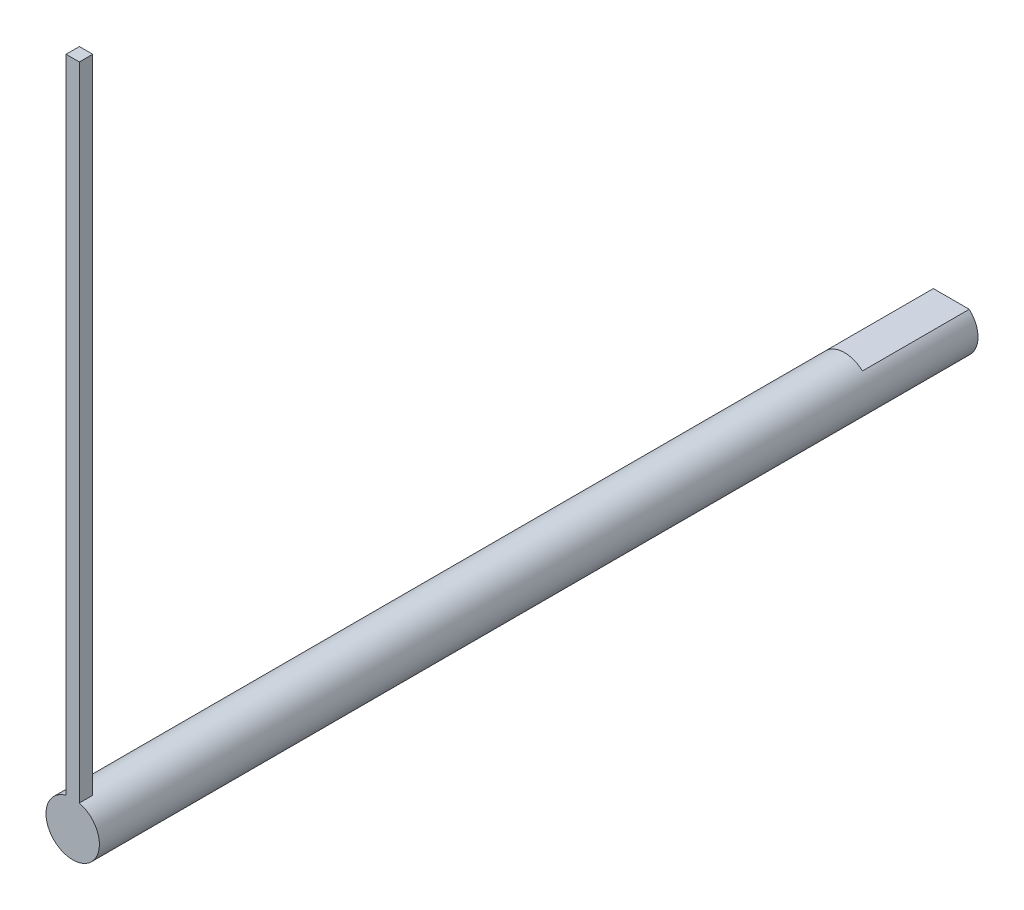
ISO-10303-21;
HEADER;
FILE_DESCRIPTION(('STEP AP214'),'2;1');
FILE_NAME('part.step','',(''),(''),'','','');
FILE_SCHEMA(('AUTOMOTIVE_DESIGN { 1 0 10303 214 1 1 1 1 }'));
ENDSEC;
DATA;
#1=APPLICATION_CONTEXT('core data for automotive mechanical design processes');
#2=APPLICATION_PROTOCOL_DEFINITION('international standard','automotive_design',2000,#1);
#3=PRODUCT_CONTEXT('',#1,'mechanical');
#4=PRODUCT('Part','Part','',(#3));
#5=PRODUCT_RELATED_PRODUCT_CATEGORY('part','',(#4));
#6=PRODUCT_DEFINITION_FORMATION('','',#4);
#7=PRODUCT_DEFINITION_CONTEXT('part definition',#1,'design');
#8=PRODUCT_DEFINITION('design','',#6,#7);
#9=PRODUCT_DEFINITION_SHAPE('','',#8);
#10=(LENGTH_UNIT() NAMED_UNIT(*) SI_UNIT(.MILLI.,.METRE.));
#11=(NAMED_UNIT(*) PLANE_ANGLE_UNIT() SI_UNIT($,.RADIAN.));
#12=(NAMED_UNIT(*) SI_UNIT($,.STERADIAN.) SOLID_ANGLE_UNIT());
#13=UNCERTAINTY_MEASURE_WITH_UNIT(LENGTH_MEASURE(1.E-05),#10,'distance_accuracy_value','');
#14=(GEOMETRIC_REPRESENTATION_CONTEXT(3) GLOBAL_UNCERTAINTY_ASSIGNED_CONTEXT((#13)) GLOBAL_UNIT_ASSIGNED_CONTEXT((#10,
#11,#12)) REPRESENTATION_CONTEXT('',''));
#15=CARTESIAN_POINT('',(0.,0.,0.));
#16=DIRECTION('',(0.,0.,1.));
#17=DIRECTION('',(1.,0.,0.));
#18=AXIS2_PLACEMENT_3D('',#15,#16,#17);
#19=CARTESIAN_POINT('',(0.,0.,65.8));
#20=DIRECTION('',(0.,0.,-1.));
#21=DIRECTION('',(-1.,0.,0.));
#22=AXIS2_PLACEMENT_3D('',#19,#20,#21);
#23=CYLINDRICAL_SURFACE('',#22,2.);
#24=CARTESIAN_POINT('',(0.,0.,64.8));
#25=DIRECTION('',(0.,0.,-1.));
#26=DIRECTION('',(-1.,0.,0.));
#27=AXIS2_PLACEMENT_3D('',#24,#25,#26);
#28=CIRCLE('',#27,2.);
#29=CARTESIAN_POINT('',(-0.5,1.93649167310371,64.8));
#30=VERTEX_POINT('',#29);
#31=CARTESIAN_POINT('',(0.5,1.93649167310371,64.8));
#32=VERTEX_POINT('',#31);
#33=EDGE_CURVE('E11',#30,#32,#28,.T.);
#34=ORIENTED_EDGE('',*,*,#33,.T.);
#35=DIRECTION('',(0.,0.,-1.));
#36=VECTOR('',#35,1.);
#37=CARTESIAN_POINT('',(0.5,1.93649167310371,65.8));
#38=LINE('',#37,#36);
#39=CARTESIAN_POINT('',(0.5,1.93649167310371,65.8));
#40=VERTEX_POINT('',#39);
#41=EDGE_CURVE('E106',#32,#40,#38,.F.);
#42=ORIENTED_EDGE('',*,*,#41,.T.);
#43=CARTESIAN_POINT('',(0.,0.,65.8));
#44=DIRECTION('',(0.,0.,1.));
#45=DIRECTION('',(1.,0.,0.));
#46=AXIS2_PLACEMENT_3D('',#43,#44,#45);
#47=CIRCLE('',#46,2.);
#48=CARTESIAN_POINT('',(-0.5,1.93649167310371,65.8));
#49=VERTEX_POINT('',#48);
#50=EDGE_CURVE('E52',#49,#40,#47,.T.);
#51=ORIENTED_EDGE('',*,*,#50,.F.);
#52=DIRECTION('',(0.,0.,-1.));
#53=VECTOR('',#52,1.);
#54=CARTESIAN_POINT('',(-0.5,1.93649167310371,65.8));
#55=LINE('',#54,#53);
#56=EDGE_CURVE('E128',#49,#30,#55,.T.);
#57=ORIENTED_EDGE('',*,*,#56,.T.);
#58=EDGE_LOOP('',(#34,#42,#51,#57));
#59=FACE_BOUND('',#58,.T.);
#60=CARTESIAN_POINT('',(0.,0.,8.));
#61=DIRECTION('',(0.,0.,-1.));
#62=DIRECTION('',(-1.,0.,0.));
#63=AXIS2_PLACEMENT_3D('',#60,#61,#62);
#64=CIRCLE('',#63,2.);
#65=CARTESIAN_POINT('',(-1.34521373766402,1.48,8.));
#66=VERTEX_POINT('',#65);
#67=CARTESIAN_POINT('',(1.34521373766402,1.48,8.));
#68=VERTEX_POINT('',#67);
#69=EDGE_CURVE('E134',#66,#68,#64,.T.);
#70=ORIENTED_EDGE('',*,*,#69,.F.);
#71=DIRECTION('',(0.,0.,-1.));
#72=VECTOR('',#71,1.);
#73=CARTESIAN_POINT('',(-1.34521373766402,1.48,8.));
#74=LINE('',#73,#72);
#75=CARTESIAN_POINT('',(-1.34521373766402,1.48,0.));
#76=VERTEX_POINT('',#75);
#77=EDGE_CURVE('E140',#66,#76,#74,.T.);
#78=ORIENTED_EDGE('',*,*,#77,.T.);
#79=CARTESIAN_POINT('',(0.,0.,0.));
#80=DIRECTION('',(0.,0.,1.));
#81=DIRECTION('',(1.,0.,0.));
#82=AXIS2_PLACEMENT_3D('',#79,#80,#81);
#83=CIRCLE('',#82,2.);
#84=CARTESIAN_POINT('',(1.34521373766402,1.48,0.));
#85=VERTEX_POINT('',#84);
#86=EDGE_CURVE('E143',#76,#85,#83,.T.);
#87=ORIENTED_EDGE('',*,*,#86,.T.);
#88=DIRECTION('',(0.,0.,-1.));
#89=VECTOR('',#88,1.);
#90=CARTESIAN_POINT('',(1.34521373766402,1.48,8.));
#91=LINE('',#90,#89);
#92=EDGE_CURVE('E67',#68,#85,#91,.T.);
#93=ORIENTED_EDGE('',*,*,#92,.F.);
#94=EDGE_LOOP('',(#70,#78,#87,#93));
#95=FACE_BOUND('',#94,.T.);
#96=ADVANCED_FACE('F45',(#59,#95),#23,.T.);
#97=CARTESIAN_POINT('',(0.,0.,65.8));
#98=DIRECTION('',(0.,0.,1.));
#99=DIRECTION('',(1.,0.,0.));
#100=AXIS2_PLACEMENT_3D('',#97,#98,#99);
#101=PLANE('',#100);
#102=ORIENTED_EDGE('',*,*,#50,.T.);
#103=DIRECTION('',(0.,1.,0.));
#104=VECTOR('',#103,1.);
#105=CARTESIAN_POINT('',(0.5,0.,65.8));
#106=LINE('',#105,#104);
#107=CARTESIAN_POINT('',(0.499999999999991,50.,65.8));
#108=VERTEX_POINT('',#107);
#109=EDGE_CURVE('E124',#40,#108,#106,.T.);
#110=ORIENTED_EDGE('',*,*,#109,.T.);
#111=DIRECTION('',(-1.,0.,0.));
#112=VECTOR('',#111,1.);
#113=CARTESIAN_POINT('',(-0.499999999999991,50.,65.8));
#114=LINE('',#113,#112);
#115=CARTESIAN_POINT('',(-0.499999999999991,50.,65.8));
#116=VERTEX_POINT('',#115);
#117=EDGE_CURVE('E114',#108,#116,#114,.T.);
#118=ORIENTED_EDGE('',*,*,#117,.T.);
#119=DIRECTION('',(0.,-1.,0.));
#120=VECTOR('',#119,1.);
#121=CARTESIAN_POINT('',(-0.5,0.,65.8));
#122=LINE('',#121,#120);
#123=EDGE_CURVE('E59',#116,#49,#122,.T.);
#124=ORIENTED_EDGE('',*,*,#123,.T.);
#125=EDGE_LOOP('',(#102,#110,#118,#124));
#126=FACE_BOUND('',#125,.T.);
#127=ADVANCED_FACE('F164',(#126),#101,.T.);
#128=CARTESIAN_POINT('',(0.,0.,0.));
#129=DIRECTION('',(0.,0.,1.));
#130=DIRECTION('',(1.,0.,0.));
#131=AXIS2_PLACEMENT_3D('',#128,#129,#130);
#132=PLANE('',#131);
#133=ORIENTED_EDGE('',*,*,#86,.F.);
#134=DIRECTION('',(-1.,0.,0.));
#135=VECTOR('',#134,1.);
#136=CARTESIAN_POINT('',(1.34521373766402,1.48,0.));
#137=LINE('',#136,#135);
#138=EDGE_CURVE('E133',#85,#76,#137,.T.);
#139=ORIENTED_EDGE('',*,*,#138,.F.);
#140=EDGE_LOOP('',(#133,#139));
#141=FACE_BOUND('',#140,.T.);
#142=ADVANCED_FACE('F150',(#141),#132,.F.);
#143=CARTESIAN_POINT('',(1.34521373766402,1.48,8.));
#144=DIRECTION('',(0.,-1.,0.));
#145=DIRECTION('',(0.,0.,-1.));
#146=AXIS2_PLACEMENT_3D('',#143,#144,#145);
#147=PLANE('',#146);
#148=ORIENTED_EDGE('',*,*,#138,.T.);
#149=ORIENTED_EDGE('',*,*,#77,.F.);
#150=DIRECTION('',(-1.,0.,0.));
#151=VECTOR('',#150,1.);
#152=CARTESIAN_POINT('',(1.34521373766402,1.48,8.));
#153=LINE('',#152,#151);
#154=EDGE_CURVE('E136',#68,#66,#153,.T.);
#155=ORIENTED_EDGE('',*,*,#154,.F.);
#156=ORIENTED_EDGE('',*,*,#92,.T.);
#157=EDGE_LOOP('',(#148,#149,#155,#156));
#158=FACE_BOUND('',#157,.T.);
#159=ADVANCED_FACE('F151',(#158),#147,.F.);
#160=CARTESIAN_POINT('',(0.,0.,8.));
#161=DIRECTION('',(0.,0.,-1.));
#162=DIRECTION('',(-1.,0.,0.));
#163=AXIS2_PLACEMENT_3D('',#160,#161,#162);
#164=PLANE('',#163);
#165=ORIENTED_EDGE('',*,*,#69,.T.);
#166=ORIENTED_EDGE('',*,*,#154,.T.);
#167=EDGE_LOOP('',(#165,#166));
#168=FACE_BOUND('',#167,.T.);
#169=ADVANCED_FACE('F153',(#168),#164,.T.);
#170=CARTESIAN_POINT('',(0.5,0.,64.8));
#171=DIRECTION('',(1.,0.,0.));
#172=DIRECTION('',(0.,1.,0.));
#173=AXIS2_PLACEMENT_3D('',#170,#171,#172);
#174=PLANE('',#173);
#175=ORIENTED_EDGE('',*,*,#41,.F.);
#176=DIRECTION('',(0.,1.,0.));
#177=VECTOR('',#176,1.);
#178=CARTESIAN_POINT('',(0.5,0.,64.8));
#179=LINE('',#178,#177);
#180=CARTESIAN_POINT('',(0.499999999999991,50.,64.8));
#181=VERTEX_POINT('',#180);
#182=EDGE_CURVE('E100',#32,#181,#179,.T.);
#183=ORIENTED_EDGE('',*,*,#182,.T.);
#184=DIRECTION('',(0.,0.,1.));
#185=VECTOR('',#184,1.);
#186=CARTESIAN_POINT('',(0.499999999999991,50.,64.8));
#187=LINE('',#186,#185);
#188=EDGE_CURVE('E103',#181,#108,#187,.T.);
#189=ORIENTED_EDGE('',*,*,#188,.T.);
#190=ORIENTED_EDGE('',*,*,#109,.F.);
#191=EDGE_LOOP('',(#175,#183,#189,#190));
#192=FACE_BOUND('',#191,.T.);
#193=ADVANCED_FACE('F102',(#192),#174,.T.);
#194=CARTESIAN_POINT('',(-0.5,0.,64.8));
#195=DIRECTION('',(-1.,0.,0.));
#196=DIRECTION('',(0.,-1.,0.));
#197=AXIS2_PLACEMENT_3D('',#194,#195,#196);
#198=PLANE('',#197);
#199=ORIENTED_EDGE('',*,*,#56,.F.);
#200=ORIENTED_EDGE('',*,*,#123,.F.);
#201=DIRECTION('',(0.,0.,1.));
#202=VECTOR('',#201,1.);
#203=CARTESIAN_POINT('',(-0.499999999999991,50.,64.8));
#204=LINE('',#203,#202);
#205=CARTESIAN_POINT('',(-0.499999999999991,50.,64.8));
#206=VERTEX_POINT('',#205);
#207=EDGE_CURVE('E115',#206,#116,#204,.T.);
#208=ORIENTED_EDGE('',*,*,#207,.F.);
#209=DIRECTION('',(0.,-1.,0.));
#210=VECTOR('',#209,1.);
#211=CARTESIAN_POINT('',(-0.5,0.,64.8));
#212=LINE('',#211,#210);
#213=EDGE_CURVE('E116',#206,#30,#212,.T.);
#214=ORIENTED_EDGE('',*,*,#213,.T.);
#215=EDGE_LOOP('',(#199,#200,#208,#214));
#216=FACE_BOUND('',#215,.T.);
#217=ADVANCED_FACE('F161',(#216),#198,.T.);
#218=CARTESIAN_POINT('',(-0.499999999999991,50.,64.8));
#219=DIRECTION('',(0.,1.,0.));
#220=DIRECTION('',(0.,0.,1.));
#221=AXIS2_PLACEMENT_3D('',#218,#219,#220);
#222=PLANE('',#221);
#223=ORIENTED_EDGE('',*,*,#117,.F.);
#224=ORIENTED_EDGE('',*,*,#188,.F.);
#225=DIRECTION('',(-1.,0.,0.));
#226=VECTOR('',#225,1.);
#227=CARTESIAN_POINT('',(-0.499999999999991,50.,64.8));
#228=LINE('',#227,#226);
#229=EDGE_CURVE('E109',#181,#206,#228,.T.);
#230=ORIENTED_EDGE('',*,*,#229,.T.);
#231=ORIENTED_EDGE('',*,*,#207,.T.);
#232=EDGE_LOOP('',(#223,#224,#230,#231));
#233=FACE_BOUND('',#232,.T.);
#234=ADVANCED_FACE('F113',(#233),#222,.T.);
#235=CARTESIAN_POINT('',(0.,0.,64.8));
#236=DIRECTION('',(0.,0.,-1.));
#237=DIRECTION('',(-1.,0.,0.));
#238=AXIS2_PLACEMENT_3D('',#235,#236,#237);
#239=PLANE('',#238);
#240=ORIENTED_EDGE('',*,*,#33,.F.);
#241=ORIENTED_EDGE('',*,*,#213,.F.);
#242=ORIENTED_EDGE('',*,*,#229,.F.);
#243=ORIENTED_EDGE('',*,*,#182,.F.);
#244=EDGE_LOOP('',(#240,#241,#242,#243));
#245=FACE_BOUND('',#244,.T.);
#246=ADVANCED_FACE('F119',(#245),#239,.T.);
#247=CLOSED_SHELL('',(#96,#127,#142,#159,#169,#193,#217,#234,#246));
#248=MANIFOLD_SOLID_BREP('B2',#247);
#249=ADVANCED_BREP_SHAPE_REPRESENTATION('',(#18,#248),#14);
#250=SHAPE_DEFINITION_REPRESENTATION(#9,#249);
ENDSEC;
END-ISO-10303-21;
